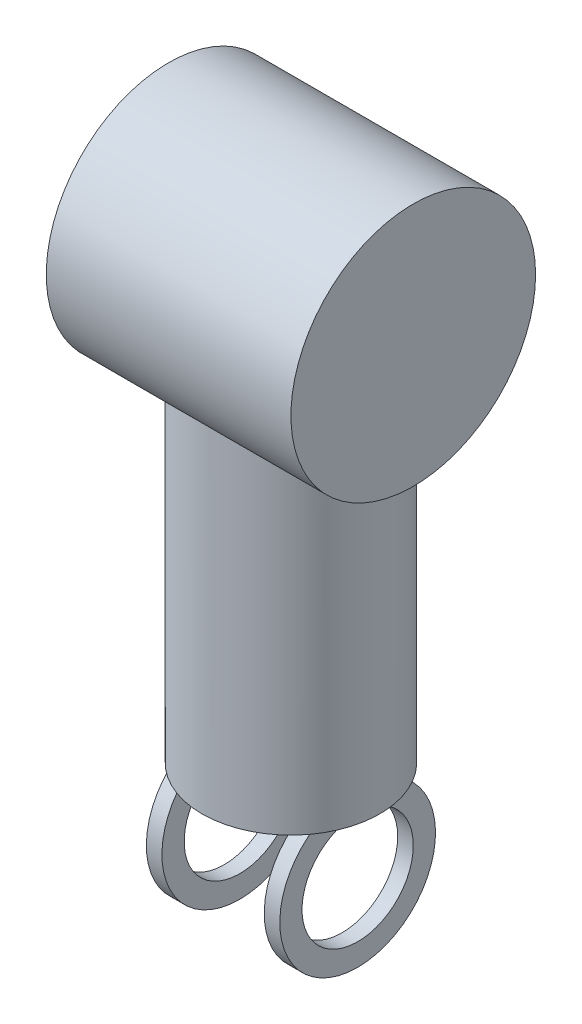
ISO-10303-21;
HEADER;
FILE_DESCRIPTION(('STEP AP214'),'2;1');
FILE_NAME('part.step','',(''),(''),'','','');
FILE_SCHEMA(('AUTOMOTIVE_DESIGN { 1 0 10303 214 1 1 1 1 }'));
ENDSEC;
DATA;
#1=APPLICATION_CONTEXT('core data for automotive mechanical design processes');
#2=APPLICATION_PROTOCOL_DEFINITION('international standard','automotive_design',2000,#1);
#3=PRODUCT_CONTEXT('',#1,'mechanical');
#4=PRODUCT('Part','Part','',(#3));
#5=PRODUCT_RELATED_PRODUCT_CATEGORY('part','',(#4));
#6=PRODUCT_DEFINITION_FORMATION('','',#4);
#7=PRODUCT_DEFINITION_CONTEXT('part definition',#1,'design');
#8=PRODUCT_DEFINITION('design','',#6,#7);
#9=PRODUCT_DEFINITION_SHAPE('','',#8);
#10=(LENGTH_UNIT() NAMED_UNIT(*) SI_UNIT(.MILLI.,.METRE.));
#11=(NAMED_UNIT(*) PLANE_ANGLE_UNIT() SI_UNIT($,.RADIAN.));
#12=(NAMED_UNIT(*) SI_UNIT($,.STERADIAN.) SOLID_ANGLE_UNIT());
#13=UNCERTAINTY_MEASURE_WITH_UNIT(LENGTH_MEASURE(1.E-05),#10,'distance_accuracy_value','');
#14=(GEOMETRIC_REPRESENTATION_CONTEXT(3) GLOBAL_UNCERTAINTY_ASSIGNED_CONTEXT((#13)) GLOBAL_UNIT_ASSIGNED_CONTEXT((#10,
#11,#12)) REPRESENTATION_CONTEXT('',''));
#15=CARTESIAN_POINT('',(0.,0.,0.));
#16=DIRECTION('',(0.,0.,1.));
#17=DIRECTION('',(1.,0.,0.));
#18=AXIS2_PLACEMENT_3D('',#15,#16,#17);
#19=CARTESIAN_POINT('',(0.,-190.,0.));
#20=DIRECTION('',(0.,1.,0.));
#21=DIRECTION('',(0.,0.,1.));
#22=AXIS2_PLACEMENT_3D('',#19,#20,#21);
#23=PLANE('',#22);
#24=DIRECTION('',(0.,0.,1.));
#25=VECTOR('',#24,1.);
#26=CARTESIAN_POINT('',(23.,-190.,18.3958933077138));
#27=LINE('',#26,#25);
#28=CARTESIAN_POINT('',(23.,-190.,-18.3958933077138));
#29=VERTEX_POINT('',#28);
#30=CARTESIAN_POINT('',(23.,-190.,18.3958933077138));
#31=VERTEX_POINT('',#30);
#32=EDGE_CURVE('E108',#29,#31,#27,.T.);
#33=ORIENTED_EDGE('',*,*,#32,.T.);
#34=DIRECTION('',(1.,0.,0.));
#35=VECTOR('',#34,1.);
#36=CARTESIAN_POINT('',(23.,-190.,18.3958933077138));
#37=LINE('',#36,#35);
#38=CARTESIAN_POINT('',(30.,-190.,18.3958933077138));
#39=VERTEX_POINT('',#38);
#40=EDGE_CURVE('E116',#31,#39,#37,.T.);
#41=ORIENTED_EDGE('',*,*,#40,.T.);
#42=DIRECTION('',(0.,0.,1.));
#43=VECTOR('',#42,1.);
#44=CARTESIAN_POINT('',(30.,-190.,18.3958933077138));
#45=LINE('',#44,#43);
#46=CARTESIAN_POINT('',(30.,-190.,-18.3958933077138));
#47=VERTEX_POINT('',#46);
#48=EDGE_CURVE('E109',#47,#39,#45,.T.);
#49=ORIENTED_EDGE('',*,*,#48,.F.);
#50=DIRECTION('',(1.,0.,0.));
#51=VECTOR('',#50,1.);
#52=CARTESIAN_POINT('',(23.,-190.,-18.3958933077138));
#53=LINE('',#52,#51);
#54=EDGE_CURVE('E112',#29,#47,#53,.T.);
#55=ORIENTED_EDGE('',*,*,#54,.F.);
#56=EDGE_LOOP('',(#33,#41,#49,#55));
#57=FACE_BOUND('',#56,.T.);
#58=CARTESIAN_POINT('',(0.,-190.,0.));
#59=DIRECTION('',(0.,1.,0.));
#60=DIRECTION('',(0.,0.,1.));
#61=AXIS2_PLACEMENT_3D('',#58,#59,#60);
#62=CIRCLE('',#61,40.);
#63=CARTESIAN_POINT('',(0.,-190.,40.));
#64=VERTEX_POINT('',#63);
#65=EDGE_CURVE('E11',#64,#64,#62,.T.);
#66=ORIENTED_EDGE('',*,*,#65,.F.);
#67=EDGE_LOOP('',(#66));
#68=FACE_BOUND('',#67,.T.);
#69=DIRECTION('',(-1.,0.,0.));
#70=VECTOR('',#69,1.);
#71=CARTESIAN_POINT('',(-23.,-190.,-18.3958933077138));
#72=LINE('',#71,#70);
#73=CARTESIAN_POINT('',(-23.,-190.,-18.3958933077138));
#74=VERTEX_POINT('',#73);
#75=CARTESIAN_POINT('',(-30.,-190.,-18.3958933077138));
#76=VERTEX_POINT('',#75);
#77=EDGE_CURVE('E58',#74,#76,#72,.T.);
#78=ORIENTED_EDGE('',*,*,#77,.T.);
#79=DIRECTION('',(0.,0.,1.));
#80=VECTOR('',#79,1.);
#81=CARTESIAN_POINT('',(-30.,-190.,18.3958933077138));
#82=LINE('',#81,#80);
#83=CARTESIAN_POINT('',(-30.,-190.,18.3958933077138));
#84=VERTEX_POINT('',#83);
#85=EDGE_CURVE('E75',#76,#84,#82,.T.);
#86=ORIENTED_EDGE('',*,*,#85,.T.);
#87=DIRECTION('',(-1.,0.,0.));
#88=VECTOR('',#87,1.);
#89=CARTESIAN_POINT('',(-23.,-190.,18.3958933077138));
#90=LINE('',#89,#88);
#91=CARTESIAN_POINT('',(-23.,-190.,18.3958933077138));
#92=VERTEX_POINT('',#91);
#93=EDGE_CURVE('E77',#92,#84,#90,.T.);
#94=ORIENTED_EDGE('',*,*,#93,.F.);
#95=DIRECTION('',(0.,0.,1.));
#96=VECTOR('',#95,1.);
#97=CARTESIAN_POINT('',(-23.,-190.,18.3958933077138));
#98=LINE('',#97,#96);
#99=EDGE_CURVE('E53',#74,#92,#98,.T.);
#100=ORIENTED_EDGE('',*,*,#99,.F.);
#101=EDGE_LOOP('',(#78,#86,#94,#100));
#102=FACE_BOUND('',#101,.T.);
#103=ADVANCED_FACE('F33',(#57,#68,#102),#23,.F.);
#104=CARTESIAN_POINT('',(55.,0.,0.));
#105=DIRECTION('',(-1.,0.,0.));
#106=DIRECTION('',(0.,0.,1.));
#107=AXIS2_PLACEMENT_3D('',#104,#105,#106);
#108=CYLINDRICAL_SURFACE('',#107,55.);
#109=CARTESIAN_POINT('',(0.,-37.7491721763537,40.));
#110=CARTESIAN_POINT('',(-0.472777525437341,-37.7491715208827,40.0000004275268));
#111=CARTESIAN_POINT('',(-0.945554287823784,-37.7580650299189,39.9916131643164));
#112=CARTESIAN_POINT('',(-1.8899123425948,-37.7935059068727,39.9581218508403));
#113=CARTESIAN_POINT('',(-2.36149346080809,-37.8200557134208,39.9330154913866));
#114=CARTESIAN_POINT('',(-3.3023760838275,-37.8904416975838,39.8662362706953));
#115=CARTESIAN_POINT('',(-3.77167662070743,-37.9342846594488,39.8245569076769));
#116=CARTESIAN_POINT('',(-4.70670406058051,-38.0386245840344,39.7249060764801));
#117=CARTESIAN_POINT('',(-5.17243045325298,-38.0991238811101,39.6669323246487));
#118=CARTESIAN_POINT('',(-6.56492360336293,-38.304768865868,39.4687413276709));
#119=CARTESIAN_POINT('',(-7.48490816670641,-38.4738991785993,39.304405011021));
#120=CARTESIAN_POINT('',(-9.29937238115574,-38.8676295989345,38.915080581805));
#121=CARTESIAN_POINT('',(-10.1938532555896,-39.092227040953,38.6900953837964));
#122=CARTESIAN_POINT('',(-11.941908076244,-39.5842739902622,38.1864823898703));
#123=CARTESIAN_POINT('',(-12.7958614603872,-39.8511317203621,37.908585991003));
#124=CARTESIAN_POINT('',(-14.4725215863588,-40.4206859617582,37.3006906044792));
#125=CARTESIAN_POINT('',(-15.2952284134522,-40.7233823752494,36.9706917590114));
#126=CARTESIAN_POINT('',(-16.907875195408,-41.3560905887806,36.2615423868658));
#127=CARTESIAN_POINT('',(-17.697824586332,-41.6860944394683,35.8824061462964));
#128=CARTESIAN_POINT('',(-19.2445291889931,-42.3658984130772,35.0771774034454));
#129=CARTESIAN_POINT('',(-20.0012821493163,-42.7156998750183,34.6510817231916));
#130=CARTESIAN_POINT('',(-21.6239684958769,-43.4970933654617,33.6670450317415));
#131=CARTESIAN_POINT('',(-22.4827812598994,-43.9314400099203,33.099530250637));
#132=CARTESIAN_POINT('',(-24.1514910524378,-44.8083783027913,31.902351613847));
#133=CARTESIAN_POINT('',(-24.9613841661636,-45.2509706073634,31.2726827948842));
#134=CARTESIAN_POINT('',(-26.5317909334083,-46.1358286658042,29.9519276134289));
#135=CARTESIAN_POINT('',(-27.2922394250646,-46.5780932586324,29.2607629369927));
#136=CARTESIAN_POINT('',(-28.760442579446,-47.4533012856293,27.8189781284543));
#137=CARTESIAN_POINT('',(-29.4681932183535,-47.8862440062231,27.0683534652156));
#138=CARTESIAN_POINT('',(-30.9549273255999,-48.814033062229,25.36335282927));
#139=CARTESIAN_POINT('',(-31.7225539740411,-49.3053529985706,24.3970953817057));
#140=CARTESIAN_POINT('',(-33.1729815917269,-50.2508147484749,22.3850535993973));
#141=CARTESIAN_POINT('',(-33.8557651183179,-50.7049489105978,21.3392529826098));
#142=CARTESIAN_POINT('',(-34.809228430649,-51.3481034619426,19.7157539862492));
#143=CARTESIAN_POINT('',(-35.1150709284651,-51.5560122401258,19.1658669340818));
#144=CARTESIAN_POINT('',(-35.7023844188761,-51.9578128359533,18.0482166653255));
#145=CARTESIAN_POINT('',(-35.9838569260276,-52.1517055245518,17.4804545626377));
#146=CARTESIAN_POINT('',(-36.5211031770272,-52.5238371754566,16.3282833701184));
#147=CARTESIAN_POINT('',(-36.7768905712406,-52.7020844461182,15.7438833367664));
#148=CARTESIAN_POINT('',(-37.2617966211442,-53.0416018958057,14.5591329962116));
#149=CARTESIAN_POINT('',(-37.4909088066728,-53.2028679550788,13.9587788624795));
#150=CARTESIAN_POINT('',(-38.0128598043247,-53.5717301271043,12.484672439551));
#151=CARTESIAN_POINT('',(-38.2912900138909,-53.7698123123291,11.6033621725185));
#152=CARTESIAN_POINT('',(-38.7879881976645,-54.1246506115559,9.8159018335571));
#153=CARTESIAN_POINT('',(-39.0062697711724,-54.2814160667107,8.90975742752422));
#154=CARTESIAN_POINT('',(-39.2863886594642,-54.4831737583324,7.53644820770415));
#155=CARTESIAN_POINT('',(-39.3718674287687,-54.5448537597165,7.07640735257552));
#156=CARTESIAN_POINT('',(-39.5268017508017,-54.6567945717336,6.15234926663021));
#157=CARTESIAN_POINT('',(-39.5962603137854,-54.707057527644,5.6883327998684));
#158=CARTESIAN_POINT('',(-39.7802284494862,-54.8403065686442,4.29129461342989));
#159=CARTESIAN_POINT('',(-39.8703487120803,-54.9057660046489,3.35319489905717));
#160=CARTESIAN_POINT('',(-39.9841971637796,-54.9884945243538,1.46878696954941));
#161=CARTESIAN_POINT('',(-40.0077717267431,-55.005652099047,0.522464811365877));
#162=CARTESIAN_POINT('',(-39.9877480180763,-54.9910895765311,-1.36911748946798));
#163=CARTESIAN_POINT('',(-39.9441500045903,-54.9593696671581,-2.31437763618564));
#164=CARTESIAN_POINT('',(-39.7904400597091,-54.8477560254818,-4.19677798516716));
#165=CARTESIAN_POINT('',(-39.6803136749483,-54.7678518250923,-5.13391637808244));
#166=CARTESIAN_POINT('',(-39.3951983977056,-54.5616346346594,-6.99305317115967));
#167=CARTESIAN_POINT('',(-39.2202097049095,-54.4353217874902,-7.91505161792252));
#168=CARTESIAN_POINT('',(-38.8138485866916,-54.143286759262,-9.71124903177319));
#169=CARTESIAN_POINT('',(-38.5842625456815,-53.978816551456,-10.5860584306442));
#170=CARTESIAN_POINT('',(-38.0690879189009,-53.6117784717427,-12.310750573055));
#171=CARTESIAN_POINT('',(-37.7835008110096,-53.4092116052196,-13.1606339737166));
#172=CARTESIAN_POINT('',(-37.1593976224529,-52.9695363924173,-14.8315430493695));
#173=CARTESIAN_POINT('',(-36.8208775840682,-52.7324254634186,-15.6525665609217));
#174=CARTESIAN_POINT('',(-36.0941201459295,-52.2275521183576,-17.2625227759151));
#175=CARTESIAN_POINT('',(-35.705879797607,-51.9597878845593,-18.0514535724997));
#176=CARTESIAN_POINT('',(-34.837319542577,-51.3665971941422,-19.6800500621035));
#177=CARTESIAN_POINT('',(-34.3515652793803,-51.0380685487559,-20.515687401547));
#178=CARTESIAN_POINT('',(-33.3266202612182,-50.353927181007,-22.1418230973124));
#179=CARTESIAN_POINT('',(-32.7874261720738,-49.9983127690495,-22.9323186323234));
#180=CARTESIAN_POINT('',(-31.6587029499332,-49.2654951297343,-24.4670109187113));
#181=CARTESIAN_POINT('',(-31.0691332049748,-48.8882745661945,-25.2111694624624));
#182=CARTESIAN_POINT('',(-29.8430475890611,-48.1183941173998,-26.6512083361569));
#183=CARTESIAN_POINT('',(-29.2065294629092,-47.7257334908948,-27.3470863437927));
#184=CARTESIAN_POINT('',(-27.7641609215849,-46.8557103346422,-28.8167116289474));
#185=CARTESIAN_POINT('',(-26.9490689528992,-46.3763878715164,-29.5802534248481));
#186=CARTESIAN_POINT('',(-25.2587939010624,-45.4150112013779,-31.036073223549));
#187=CARTESIAN_POINT('',(-24.3835988541403,-44.9329564681178,-31.7283369692121));
#188=CARTESIAN_POINT('',(-22.5749815250504,-43.977719331239,-33.0396468568349));
#189=CARTESIAN_POINT('',(-21.6415450155899,-43.5045391325068,-33.6586750009159));
#190=CARTESIAN_POINT('',(-19.7180285840917,-42.5803859618246,-34.8204143027477));
#191=CARTESIAN_POINT('',(-18.7279635769952,-42.1294072001062,-35.3631454267461));
#192=CARTESIAN_POINT('',(-16.9133580344208,-41.358696785528,-36.2591766213804));
#193=CARTESIAN_POINT('',(-16.0995482891531,-41.031727590498,-36.6280215975784));
#194=CARTESIAN_POINT('',(-14.4387104354404,-40.4089578557714,-37.3139472299466));
#195=CARTESIAN_POINT('',(-13.5916838521959,-40.1131558872793,-37.6310302594001));
#196=CARTESIAN_POINT('',(-11.8677700370794,-39.5623346299101,-38.2096989752337));
#197=CARTESIAN_POINT('',(-10.9909416199677,-39.307240095739,-38.4713873548394));
#198=CARTESIAN_POINT('',(-9.20912659374681,-38.8467281692586,-38.9363463957933));
#199=CARTESIAN_POINT('',(-8.30414578504876,-38.6413006192691,-39.1396290036459));
#200=CARTESIAN_POINT('',(-6.62111121052336,-38.3180504855299,-39.4559173618477));
#201=CARTESIAN_POINT('',(-5.84650411293052,-38.1913951767207,-39.578250171628));
#202=CARTESIAN_POINT('',(-4.28540063745122,-37.9837680583105,-39.7775593585752));
#203=CARTESIAN_POINT('',(-3.4989056562417,-37.9027909242814,-39.8545410220969));
#204=CARTESIAN_POINT('',(-1.91976397266554,-37.7897581150668,-39.9617356376636));
#205=CARTESIAN_POINT('',(-1.12712205764128,-37.7576675910857,-39.9919819052323));
#206=CARTESIAN_POINT('',(0.459026953557407,-37.7436327359253,-40.0052283519457));
#207=CARTESIAN_POINT('',(1.2525340688565,-37.7616895366411,-39.9882274646563));
#208=CARTESIAN_POINT('',(2.83336894125615,-37.8471366850775,-39.9073631368482));
#209=CARTESIAN_POINT('',(3.62070359863762,-37.9144603468173,-39.8435630419003));
#210=CARTESIAN_POINT('',(5.18484676476512,-38.09565554189,-39.6703494690531));
#211=CARTESIAN_POINT('',(5.96165529829737,-38.2095269655959,-39.5609360985802));
#212=CARTESIAN_POINT('',(7.50127900420736,-38.4797851873003,-39.2981115828839));
#213=CARTESIAN_POINT('',(8.26407453138094,-38.6362274345037,-39.1446430406485));
#214=CARTESIAN_POINT('',(9.77128440843401,-38.9864121237655,-38.7958844658502));
#215=CARTESIAN_POINT('',(10.5156961620232,-39.1801598007627,-38.6005885633695));
#216=CARTESIAN_POINT('',(12.2805548754334,-39.6842062471464,-38.0833498706039));
#217=CARTESIAN_POINT('',(13.2909753372365,-40.0099634277059,-37.7421214454983));
#218=CARTESIAN_POINT('',(15.267204604008,-40.7091151140211,-36.9869248432945));
#219=CARTESIAN_POINT('',(16.2329950544541,-41.0825289856973,-36.5729270694724));
#220=CARTESIAN_POINT('',(18.1194666874195,-41.8637887499044,-35.6760063128531));
#221=CARTESIAN_POINT('',(19.040073386956,-42.2716886644418,-35.192974339965));
#222=CARTESIAN_POINT('',(20.8334644887245,-43.1092168291042,-34.1619171767386));
#223=CARTESIAN_POINT('',(21.7062537950731,-43.5388428422926,-33.6138986696828));
#224=CARTESIAN_POINT('',(23.428651190164,-44.4222802566785,-32.4379089786043));
#225=CARTESIAN_POINT('',(24.2767869074823,-44.8764307315186,-31.8080377881027));
#226=CARTESIAN_POINT('',(25.920189842108,-45.7863316069423,-30.4837235066798));
#227=CARTESIAN_POINT('',(26.7154546696387,-46.2420820788673,-29.7892775003601));
#228=CARTESIAN_POINT('',(28.2503226753508,-47.1454796126411,-28.3378531847097));
#229=CARTESIAN_POINT('',(28.9899690771941,-47.5931327574462,-27.5809244137727));
#230=CARTESIAN_POINT('',(30.4112071778751,-48.4719479976589,-26.0054568741482));
#231=CARTESIAN_POINT('',(31.0928018920726,-48.9031109489695,-25.1869213096474));
#232=CARTESIAN_POINT('',(32.3654588752856,-49.7221919498896,-23.5270535108251));
#233=CARTESIAN_POINT('',(32.9591783472252,-50.1111768735611,-22.6882884898475));
#234=CARTESIAN_POINT('',(34.0856178398835,-50.8591390404203,-20.9579634023477));
#235=CARTESIAN_POINT('',(34.6183394753056,-51.2181170778669,-20.0664047343));
#236=CARTESIAN_POINT('',(35.6178336416793,-51.8989038940104,-18.2334645335709));
#237=CARTESIAN_POINT('',(36.0846119391558,-52.220715922301,-17.2920873672592));
#238=CARTESIAN_POINT('',(36.9469001279355,-52.8202368285406,-15.3636662635375));
#239=CARTESIAN_POINT('',(37.3424105971396,-53.0979460641108,-14.3766226965115));
#240=CARTESIAN_POINT('',(38.0597908857208,-53.6048748069556,-12.3536612326338));
#241=CARTESIAN_POINT('',(38.3810032362989,-53.8336601353337,-11.3173980422342));
#242=CARTESIAN_POINT('',(38.8002512000713,-54.1336320686886,-9.73846266163449));
#243=CARTESIAN_POINT('',(38.9295907021352,-54.2264352151313,-9.2079577393254));
#244=CARTESIAN_POINT('',(39.1668547154087,-54.3970189136481,-8.13981483227865));
#245=CARTESIAN_POINT('',(39.2747820943924,-54.4748014774257,-7.60217781306308));
#246=CARTESIAN_POINT('',(39.4686338653715,-54.6147285288753,-6.5213643450058));
#247=CARTESIAN_POINT('',(39.5545747563976,-54.6768847422138,-5.97819236986744));
#248=CARTESIAN_POINT('',(39.7041271513716,-54.7851718258269,-4.887265370253));
#249=CARTESIAN_POINT('',(39.7677416177816,-54.8313048221914,-4.33951096369593));
#250=CARTESIAN_POINT('',(39.8723225922731,-54.9072017622569,-3.24073788632891));
#251=CARTESIAN_POINT('',(39.9132905495326,-54.936966753366,-2.68971942667094));
#252=CARTESIAN_POINT('',(39.972373424598,-54.9799077863742,-1.58587309377786));
#253=CARTESIAN_POINT('',(39.9904892403527,-54.9930844800914,-1.03304529249462));
#254=CARTESIAN_POINT('',(40.008477855071,-55.0061634179417,0.467336820707096));
#255=CARTESIAN_POINT('',(39.9861509352134,-54.98991477589,1.41544300835717));
#256=CARTESIAN_POINT('',(39.8744404401192,-54.9087387863928,3.3053561929011));
#257=CARTESIAN_POINT('',(39.785064479232,-54.8438169664629,4.24716389282344));
#258=CARTESIAN_POINT('',(39.5406495683541,-54.6667711484699,6.11773316185043));
#259=CARTESIAN_POINT('',(39.3856094966133,-54.5546463440312,7.04649450780215));
#260=CARTESIAN_POINT('',(39.012108754824,-54.2856137945498,8.88453725346419));
#261=CARTESIAN_POINT('',(38.793646150833,-54.1287046839023,9.7938180582466));
#262=CARTESIAN_POINT('',(38.3015604273908,-53.7771378929718,11.5680525356288));
#263=CARTESIAN_POINT('',(38.0292199963387,-53.5833614108389,12.4335385785516));
#264=CARTESIAN_POINT('',(37.42974036491,-53.1595760548316,14.1360926043604));
#265=CARTESIAN_POINT('',(37.1026027427616,-52.9295682244772,14.9731614048641));
#266=CARTESIAN_POINT('',(36.3967978609415,-52.437228675344,16.6154142377248));
#267=CARTESIAN_POINT('',(36.0181291414834,-52.1748960408796,17.4205973659818));
#268=CARTESIAN_POINT('',(35.2125177371522,-51.6220454109289,18.9963622170251));
#269=CARTESIAN_POINT('',(34.7855719220647,-51.3315255880012,19.7669416916315));
#270=CARTESIAN_POINT('',(33.8269493097988,-50.6864929406944,21.3710625319133));
#271=CARTESIAN_POINT('',(33.2888903432122,-50.3286001156704,22.1994327424693));
#272=CARTESIAN_POINT('',(32.1588666861314,-49.5884099485121,23.8069918074183));
#273=CARTESIAN_POINT('',(31.5668979360292,-49.2061107691374,24.5861769504991));
#274=CARTESIAN_POINT('',(30.3317735911873,-48.4230116088112,26.0947313347517));
#275=CARTESIAN_POINT('',(29.6885571022254,-48.0221898634905,26.8240393398735));
#276=CARTESIAN_POINT('',(28.3543735243903,-47.2090119336632,28.230644423492));
#277=CARTESIAN_POINT('',(27.6634043452695,-46.7966552447158,28.9079392225051));
#278=CARTESIAN_POINT('',(26.1002989751669,-45.8884214619233,30.3330760409891));
#279=CARTESIAN_POINT('',(25.2186698989358,-45.3915479500449,31.0699064704151));
#280=CARTESIAN_POINT('',(23.3931554901753,-44.4032713198633,32.4666218617275));
#281=CARTESIAN_POINT('',(22.449254516768,-43.9118696124198,33.126487376197));
#282=CARTESIAN_POINT('',(20.5012875766152,-42.9486453882985,34.3661117290513));
#283=CARTESIAN_POINT('',(19.497244985812,-42.476815383607,34.9459014054813));
#284=CARTESIAN_POINT('',(17.4300906834097,-41.5685778235717,36.0214987237603));
#285=CARTESIAN_POINT('',(16.3670053891275,-41.1321546379399,36.5173435291655));
#286=CARTESIAN_POINT('',(14.5013704660994,-40.4323567159635,37.2882223800122));
#287=CARTESIAN_POINT('',(13.7130033893808,-40.1555760524169,37.5855283937744));
#288=CARTESIAN_POINT('',(12.1087493616476,-39.6364217616533,38.1326139822269));
#289=CARTESIAN_POINT('',(11.2928629078207,-39.394047513233,38.382394415013));
#290=CARTESIAN_POINT('',(9.63833047687809,-38.9520745920685,38.8308502432068));
#291=CARTESIAN_POINT('',(8.79975526744725,-38.7523570720073,39.0296679456685));
#292=CARTESIAN_POINT('',(7.10189336319898,-38.4024381705056,39.3740154562367));
#293=CARTESIAN_POINT('',(6.2426162537186,-38.2522143281255,39.5195694395109));
#294=CARTESIAN_POINT('',(4.49070461477094,-38.0052700747118,39.7571364997708));
#295=CARTESIAN_POINT('',(3.59774695233555,-37.9096946046393,39.8480057915954));
#296=CARTESIAN_POINT('',(2.25210556637388,-37.8136336593572,39.9390873108764));
#297=CARTESIAN_POINT('',(1.80243615244699,-37.7894969633027,39.9619107854496));
#298=CARTESIAN_POINT('',(0.901844472254169,-37.7572642766446,39.9923690639454));
#299=CARTESIAN_POINT('',(0.45092188906074,-37.7491728015236,39.999999592237));
#300=CARTESIAN_POINT('',(0.,-37.7491721763537,40.));
#301=B_SPLINE_CURVE_WITH_KNOTS('',3,(#109,#110,#111,#112,#113,#114,#115,#116,#117,#118,#119,
#120,#121,#122,#123,#124,#125,#126,#127,#128,#129,#130,#131,#132,#133,#134,#135,#136,#137,#138,
#139,#140,#141,#142,#143,#144,#145,#146,#147,#148,#149,#150,#151,#152,#153,#154,#155,#156,#157,
#158,#159,#160,#161,#162,#163,#164,#165,#166,#167,#168,#169,#170,#171,#172,#173,#174,#175,#176,
#177,#178,#179,#180,#181,#182,#183,#184,#185,#186,#187,#188,#189,#190,#191,#192,#193,#194,#195,
#196,#197,#198,#199,#200,#201,#202,#203,#204,#205,#206,#207,#208,#209,#210,#211,#212,#213,#214,
#215,#216,#217,#218,#219,#220,#221,#222,#223,#224,#225,#226,#227,#228,#229,#230,#231,#232,#233,
#234,#235,#236,#237,#238,#239,#240,#241,#242,#243,#244,#245,#246,#247,#248,#249,#250,#251,#252,
#253,#254,#255,#256,#257,#258,#259,#260,#261,#262,#263,#264,#265,#266,#267,#268,#269,#270,#271,
#272,#273,#274,#275,#276,#277,#278,#279,#280,#281,#282,#283,#284,#285,#286,#287,#288,#289,#290,
#291,#292,#293,#294,#295,#296,#297,#298,#299,#300),.UNSPECIFIED.,.T.,.F.,(4,2,2,2,2,2,2,2,2,2,2,
2,2,2,2,2,2,2,2,2,2,2,2,2,2,2,2,2,2,2,2,2,2,2,2,2,2,2,2,2,2,2,2,2,2,2,2,2,2,2,2,2,2,2,2,2,2,2,2,
2,2,2,2,2,2,2,2,2,2,2,2,2,2,2,2,2,2,2,2,2,2,2,2,2,2,2,2,2,2,2,2,2,2,2,2,4),(0.,1.41817314487782,
2.83654220390633,4.2554682553604,5.67459326805596,8.51913928584883,11.3635486298033,
14.1711709527896,16.9787856138468,19.7855858181162,22.5925760888972,25.9413792095489,
29.2904499637538,32.6438484769821,35.9975027815756,39.9770411137444,43.9573962388973,
45.9447367620128,47.9319536862378,49.9181088506261,51.9047447644153,54.7373517689913,
57.5693178090741,58.984830244498,60.4000764828871,63.2302938632547,66.0670397072402,
68.9037746496365,71.7411260977141,74.5784688107586,77.3333541640479,80.0881668251437,
82.8431855582058,85.5983677481409,88.6580313861988,91.7178860408983,94.7802312010201,
97.8427235588431,101.485105766837,105.128215119738,108.772217926556,112.415265348186,
115.267379570775,118.119362987287,120.966012039465,123.812078413694,126.192693958901,
128.573031952805,130.951672328648,133.330366394158,135.705846680131,138.08132137151,
140.459905092041,142.838822834374,146.179150805081,149.520840509756,152.867865528382,
156.214546633518,159.661247792294,163.108104637004,166.552254474655,169.996225304711,
173.28940824563,176.582503990939,179.875311587532,183.168092482005,186.488982766594,
188.15005862881,189.810911868964,191.470515096721,193.129898030716,194.789174766462,
196.448386300811,199.289972922009,202.131236890438,204.972549398576,207.813948555921,
210.594444608118,213.374860592282,216.155355357198,218.936030508709,222.084851997118,
225.233910799919,228.386768878178,231.539765051978,235.291243123347,239.043667070229,
242.794641865583,246.54395168515,249.202470900372,251.86094211028,254.511906951875,
257.16166708522,259.865080205933,261.217313317359,262.569926923329),.UNSPECIFIED.);
#302=CARTESIAN_POINT('',(0.,-37.7491721763537,40.));
#303=VERTEX_POINT('',#302);
#304=EDGE_CURVE('E38',#303,#303,#301,.T.);
#305=ORIENTED_EDGE('',*,*,#304,.F.);
#306=EDGE_LOOP('',(#305));
#307=FACE_BOUND('',#306,.T.);
#308=CARTESIAN_POINT('',(55.,0.,0.));
#309=DIRECTION('',(1.,0.,0.));
#310=DIRECTION('',(0.,0.,-1.));
#311=AXIS2_PLACEMENT_3D('',#308,#309,#310);
#312=CIRCLE('',#311,55.);
#313=CARTESIAN_POINT('',(55.,0.,-55.));
#314=VERTEX_POINT('',#313);
#315=EDGE_CURVE('E122',#314,#314,#312,.T.);
#316=ORIENTED_EDGE('',*,*,#315,.F.);
#317=EDGE_LOOP('',(#316));
#318=FACE_BOUND('',#317,.T.);
#319=CARTESIAN_POINT('',(-55.,0.,0.));
#320=DIRECTION('',(1.,0.,0.));
#321=DIRECTION('',(0.,0.,-1.));
#322=AXIS2_PLACEMENT_3D('',#319,#320,#321);
#323=CIRCLE('',#322,55.);
#324=CARTESIAN_POINT('',(-55.,0.,-55.));
#325=VERTEX_POINT('',#324);
#326=EDGE_CURVE('E119',#325,#325,#323,.T.);
#327=ORIENTED_EDGE('',*,*,#326,.T.);
#328=EDGE_LOOP('',(#327));
#329=FACE_BOUND('',#328,.T.);
#330=ADVANCED_FACE('F128',(#307,#318,#329),#108,.T.);
#331=CARTESIAN_POINT('',(55.,0.,0.));
#332=DIRECTION('',(1.,0.,0.));
#333=DIRECTION('',(0.,0.,-1.));
#334=AXIS2_PLACEMENT_3D('',#331,#332,#333);
#335=PLANE('',#334);
#336=ORIENTED_EDGE('',*,*,#315,.T.);
#337=EDGE_LOOP('',(#336));
#338=FACE_BOUND('',#337,.T.);
#339=ADVANCED_FACE('F132',(#338),#335,.T.);
#340=CARTESIAN_POINT('',(-55.,0.,0.));
#341=DIRECTION('',(1.,0.,0.));
#342=DIRECTION('',(0.,0.,-1.));
#343=AXIS2_PLACEMENT_3D('',#340,#341,#342);
#344=PLANE('',#343);
#345=ORIENTED_EDGE('',*,*,#326,.F.);
#346=EDGE_LOOP('',(#345));
#347=FACE_BOUND('',#346,.T.);
#348=ADVANCED_FACE('F130',(#347),#344,.F.);
#349=CARTESIAN_POINT('',(0.,-190.,0.));
#350=DIRECTION('',(0.,1.,0.));
#351=DIRECTION('',(0.,0.,1.));
#352=AXIS2_PLACEMENT_3D('',#349,#350,#351);
#353=CYLINDRICAL_SURFACE('',#352,40.);
#354=ORIENTED_EDGE('',*,*,#65,.T.);
#355=EDGE_LOOP('',(#354));
#356=FACE_BOUND('',#355,.T.);
#357=ORIENTED_EDGE('',*,*,#304,.T.);
#358=EDGE_LOOP('',(#357));
#359=FACE_BOUND('',#358,.T.);
#360=ADVANCED_FACE('F35',(#356,#359),#353,.T.);
#361=CARTESIAN_POINT('',(23.,-219.775679831218,0.));
#362=DIRECTION('',(1.,0.,0.));
#363=DIRECTION('',(0.,0.,-1.));
#364=AXIS2_PLACEMENT_3D('',#361,#362,#363);
#365=CYLINDRICAL_SURFACE('',#364,35.);
#366=CARTESIAN_POINT('',(30.,-219.775679831218,0.));
#367=DIRECTION('',(1.,0.,0.));
#368=DIRECTION('',(0.,0.,-1.));
#369=AXIS2_PLACEMENT_3D('',#366,#367,#368);
#370=CIRCLE('',#369,35.);
#371=EDGE_CURVE('E103',#39,#47,#370,.T.);
#372=ORIENTED_EDGE('',*,*,#371,.F.);
#373=ORIENTED_EDGE('',*,*,#40,.F.);
#374=CARTESIAN_POINT('',(23.,-219.775679831218,0.));
#375=DIRECTION('',(1.,0.,0.));
#376=DIRECTION('',(0.,0.,-1.));
#377=AXIS2_PLACEMENT_3D('',#374,#375,#376);
#378=CIRCLE('',#377,35.);
#379=EDGE_CURVE('E106',#31,#29,#378,.T.);
#380=ORIENTED_EDGE('',*,*,#379,.T.);
#381=ORIENTED_EDGE('',*,*,#54,.T.);
#382=EDGE_LOOP('',(#372,#373,#380,#381));
#383=FACE_BOUND('',#382,.T.);
#384=ADVANCED_FACE('F138',(#383),#365,.T.);
#385=CARTESIAN_POINT('',(23.,-219.775679831218,0.));
#386=DIRECTION('',(1.,0.,0.));
#387=DIRECTION('',(0.,0.,-1.));
#388=AXIS2_PLACEMENT_3D('',#385,#386,#387);
#389=PLANE('',#388);
#390=CARTESIAN_POINT('',(23.,-219.775679831218,0.));
#391=DIRECTION('',(1.,0.,0.));
#392=DIRECTION('',(0.,0.,-1.));
#393=AXIS2_PLACEMENT_3D('',#390,#391,#392);
#394=CIRCLE('',#393,25.);
#395=CARTESIAN_POINT('',(23.,-219.775679831218,-25.));
#396=VERTEX_POINT('',#395);
#397=EDGE_CURVE('E100',#396,#396,#394,.T.);
#398=ORIENTED_EDGE('',*,*,#397,.T.);
#399=EDGE_LOOP('',(#398));
#400=FACE_BOUND('',#399,.T.);
#401=ORIENTED_EDGE('',*,*,#379,.F.);
#402=ORIENTED_EDGE('',*,*,#32,.F.);
#403=EDGE_LOOP('',(#401,#402));
#404=FACE_BOUND('',#403,.T.);
#405=ADVANCED_FACE('F161',(#400,#404),#389,.F.);
#406=CARTESIAN_POINT('',(30.,-219.775679831218,0.));
#407=DIRECTION('',(1.,0.,0.));
#408=DIRECTION('',(0.,0.,-1.));
#409=AXIS2_PLACEMENT_3D('',#406,#407,#408);
#410=PLANE('',#409);
#411=CARTESIAN_POINT('',(30.,-219.775679831218,0.));
#412=DIRECTION('',(1.,0.,0.));
#413=DIRECTION('',(0.,0.,-1.));
#414=AXIS2_PLACEMENT_3D('',#411,#412,#413);
#415=CIRCLE('',#414,25.);
#416=CARTESIAN_POINT('',(30.,-219.775679831218,-25.));
#417=VERTEX_POINT('',#416);
#418=EDGE_CURVE('E98',#417,#417,#415,.T.);
#419=ORIENTED_EDGE('',*,*,#418,.F.);
#420=EDGE_LOOP('',(#419));
#421=FACE_BOUND('',#420,.T.);
#422=ORIENTED_EDGE('',*,*,#371,.T.);
#423=ORIENTED_EDGE('',*,*,#48,.T.);
#424=EDGE_LOOP('',(#422,#423));
#425=FACE_BOUND('',#424,.T.);
#426=ADVANCED_FACE('F164',(#421,#425),#410,.T.);
#427=CARTESIAN_POINT('',(23.,-219.775679831218,0.));
#428=DIRECTION('',(1.,0.,0.));
#429=DIRECTION('',(0.,0.,-1.));
#430=AXIS2_PLACEMENT_3D('',#427,#428,#429);
#431=CYLINDRICAL_SURFACE('',#430,25.);
#432=ORIENTED_EDGE('',*,*,#397,.F.);
#433=EDGE_LOOP('',(#432));
#434=FACE_BOUND('',#433,.T.);
#435=ORIENTED_EDGE('',*,*,#418,.T.);
#436=EDGE_LOOP('',(#435));
#437=FACE_BOUND('',#436,.T.);
#438=ADVANCED_FACE('F166',(#434,#437),#431,.F.);
#439=CARTESIAN_POINT('',(-23.,-219.775679831218,0.));
#440=DIRECTION('',(-1.,0.,0.));
#441=DIRECTION('',(0.,0.,-1.));
#442=AXIS2_PLACEMENT_3D('',#439,#440,#441);
#443=PLANE('',#442);
#444=CARTESIAN_POINT('',(-23.,-219.775679831218,0.));
#445=DIRECTION('',(1.,0.,0.));
#446=DIRECTION('',(0.,0.,-1.));
#447=AXIS2_PLACEMENT_3D('',#444,#445,#446);
#448=CIRCLE('',#447,35.);
#449=EDGE_CURVE('E81',#92,#74,#448,.T.);
#450=ORIENTED_EDGE('',*,*,#449,.T.);
#451=ORIENTED_EDGE('',*,*,#99,.T.);
#452=EDGE_LOOP('',(#450,#451));
#453=FACE_BOUND('',#452,.T.);
#454=CARTESIAN_POINT('',(-23.,-219.775679831218,0.));
#455=DIRECTION('',(1.,0.,0.));
#456=DIRECTION('',(0.,0.,-1.));
#457=AXIS2_PLACEMENT_3D('',#454,#455,#456);
#458=CIRCLE('',#457,25.);
#459=CARTESIAN_POINT('',(-23.,-219.775679831218,-25.));
#460=VERTEX_POINT('',#459);
#461=EDGE_CURVE('E90',#460,#460,#458,.T.);
#462=ORIENTED_EDGE('',*,*,#461,.F.);
#463=EDGE_LOOP('',(#462));
#464=FACE_BOUND('',#463,.T.);
#465=ADVANCED_FACE('F173',(#453,#464),#443,.F.);
#466=CARTESIAN_POINT('',(-30.,-219.775679831218,0.));
#467=DIRECTION('',(-1.,0.,0.));
#468=DIRECTION('',(0.,0.,-1.));
#469=AXIS2_PLACEMENT_3D('',#466,#467,#468);
#470=PLANE('',#469);
#471=CARTESIAN_POINT('',(-30.,-219.775679831218,0.));
#472=DIRECTION('',(1.,0.,0.));
#473=DIRECTION('',(0.,0.,-1.));
#474=AXIS2_PLACEMENT_3D('',#471,#472,#473);
#475=CIRCLE('',#474,35.);
#476=EDGE_CURVE('E82',#84,#76,#475,.T.);
#477=ORIENTED_EDGE('',*,*,#476,.F.);
#478=ORIENTED_EDGE('',*,*,#85,.F.);
#479=EDGE_LOOP('',(#477,#478));
#480=FACE_BOUND('',#479,.T.);
#481=CARTESIAN_POINT('',(-30.,-219.775679831218,0.));
#482=DIRECTION('',(1.,0.,0.));
#483=DIRECTION('',(0.,0.,-1.));
#484=AXIS2_PLACEMENT_3D('',#481,#482,#483);
#485=CIRCLE('',#484,25.);
#486=CARTESIAN_POINT('',(-30.,-219.775679831218,-25.));
#487=VERTEX_POINT('',#486);
#488=EDGE_CURVE('E93',#487,#487,#485,.T.);
#489=ORIENTED_EDGE('',*,*,#488,.T.);
#490=EDGE_LOOP('',(#489));
#491=FACE_BOUND('',#490,.T.);
#492=ADVANCED_FACE('F88',(#480,#491),#470,.T.);
#493=CARTESIAN_POINT('',(-23.,-219.775679831218,0.));
#494=DIRECTION('',(-1.,0.,0.));
#495=DIRECTION('',(0.,0.,1.));
#496=AXIS2_PLACEMENT_3D('',#493,#494,#495);
#497=CYLINDRICAL_SURFACE('',#496,35.);
#498=ORIENTED_EDGE('',*,*,#476,.T.);
#499=ORIENTED_EDGE('',*,*,#77,.F.);
#500=ORIENTED_EDGE('',*,*,#449,.F.);
#501=ORIENTED_EDGE('',*,*,#93,.T.);
#502=EDGE_LOOP('',(#498,#499,#500,#501));
#503=FACE_BOUND('',#502,.T.);
#504=ADVANCED_FACE('F86',(#503),#497,.T.);
#505=CARTESIAN_POINT('',(-23.,-219.775679831218,0.));
#506=DIRECTION('',(-1.,0.,0.));
#507=DIRECTION('',(0.,0.,1.));
#508=AXIS2_PLACEMENT_3D('',#505,#506,#507);
#509=CYLINDRICAL_SURFACE('',#508,25.);
#510=ORIENTED_EDGE('',*,*,#461,.T.);
#511=EDGE_LOOP('',(#510));
#512=FACE_BOUND('',#511,.T.);
#513=ORIENTED_EDGE('',*,*,#488,.F.);
#514=EDGE_LOOP('',(#513));
#515=FACE_BOUND('',#514,.T.);
#516=ADVANCED_FACE('F229',(#512,#515),#509,.F.);
#517=CLOSED_SHELL('',(#103,#330,#339,#348,#360,#384,#405,#426,#438,#465,#492,#504,#516));
#518=MANIFOLD_SOLID_BREP('B2',#517);
#519=ADVANCED_BREP_SHAPE_REPRESENTATION('',(#18,#518),#14);
#520=SHAPE_DEFINITION_REPRESENTATION(#9,#519);
ENDSEC;
END-ISO-10303-21;
